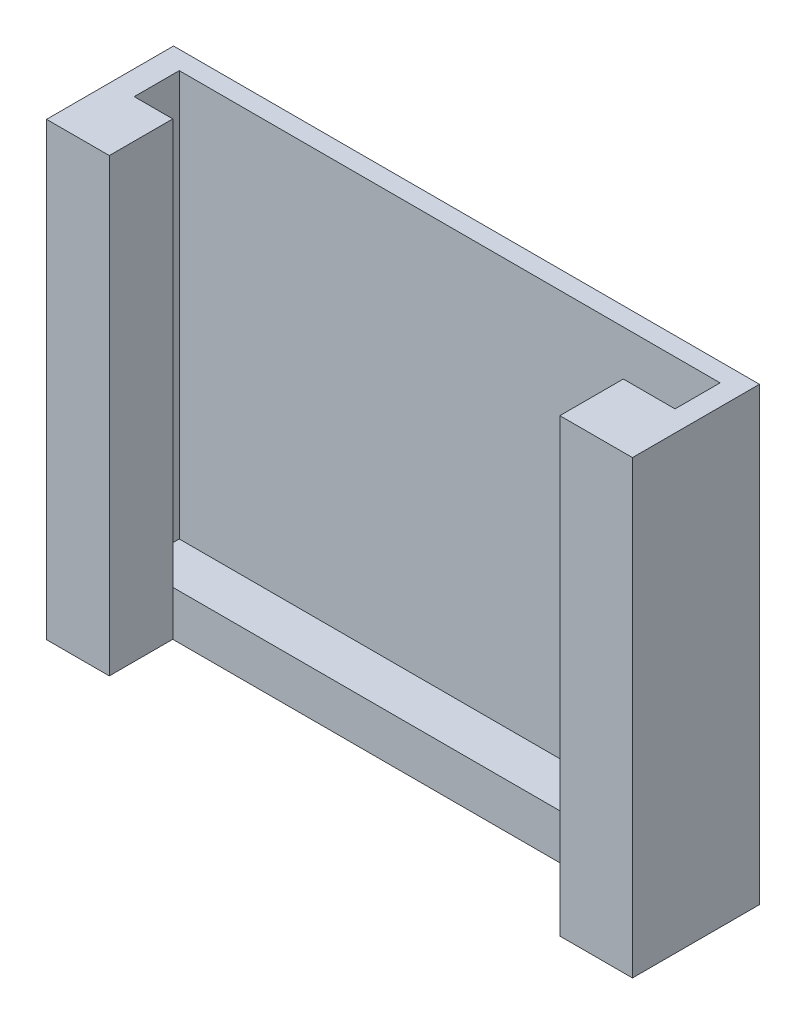
ISO-10303-21;
HEADER;
FILE_DESCRIPTION(('STEP AP214'),'2;1');
FILE_NAME('part.step','',(''),(''),'','','');
FILE_SCHEMA(('AUTOMOTIVE_DESIGN { 1 0 10303 214 1 1 1 1 }'));
ENDSEC;
DATA;
#1=APPLICATION_CONTEXT('core data for automotive mechanical design processes');
#2=APPLICATION_PROTOCOL_DEFINITION('international standard','automotive_design',2000,#1);
#3=PRODUCT_CONTEXT('',#1,'mechanical');
#4=PRODUCT('Part','Part','',(#3));
#5=PRODUCT_RELATED_PRODUCT_CATEGORY('part','',(#4));
#6=PRODUCT_DEFINITION_FORMATION('','',#4);
#7=PRODUCT_DEFINITION_CONTEXT('part definition',#1,'design');
#8=PRODUCT_DEFINITION('design','',#6,#7);
#9=PRODUCT_DEFINITION_SHAPE('','',#8);
#10=(LENGTH_UNIT() NAMED_UNIT(*) SI_UNIT(.MILLI.,.METRE.));
#11=(NAMED_UNIT(*) PLANE_ANGLE_UNIT() SI_UNIT($,.RADIAN.));
#12=(NAMED_UNIT(*) SI_UNIT($,.STERADIAN.) SOLID_ANGLE_UNIT());
#13=UNCERTAINTY_MEASURE_WITH_UNIT(LENGTH_MEASURE(1.E-05),#10,'distance_accuracy_value','');
#14=(GEOMETRIC_REPRESENTATION_CONTEXT(3) GLOBAL_UNCERTAINTY_ASSIGNED_CONTEXT((#13)) GLOBAL_UNIT_ASSIGNED_CONTEXT((#10,
#11,#12)) REPRESENTATION_CONTEXT('',''));
#15=CARTESIAN_POINT('',(0.,0.,0.));
#16=DIRECTION('',(0.,0.,1.));
#17=DIRECTION('',(1.,0.,0.));
#18=AXIS2_PLACEMENT_3D('',#15,#16,#17);
#19=CARTESIAN_POINT('',(6.03648479138952,0.999999999999999,-12.5905847925973));
#20=DIRECTION('',(0.,0.,1.));
#21=DIRECTION('',(1.,0.,0.));
#22=AXIS2_PLACEMENT_3D('',#19,#20,#21);
#23=PLANE('',#22);
#24=DIRECTION('',(1.,0.,0.));
#25=VECTOR('',#24,1.);
#26=CARTESIAN_POINT('',(6.03648479138952,0.999999999999999,-12.5905847925973));
#27=LINE('',#26,#25);
#28=CARTESIAN_POINT('',(4.88896204619608,0.999999999999999,-12.5905847925973));
#29=VERTEX_POINT('',#28);
#30=CARTESIAN_POINT('',(6.03648479138952,0.999999999999999,-12.5905847925973));
#31=VERTEX_POINT('',#30);
#32=EDGE_CURVE('E215',#29,#31,#27,.T.);
#33=ORIENTED_EDGE('',*,*,#32,.F.);
#34=DIRECTION('',(0.,1.,0.));
#35=VECTOR('',#34,1.);
#36=CARTESIAN_POINT('',(4.88896204619608,0.,-12.5905847925973));
#37=LINE('',#36,#35);
#38=CARTESIAN_POINT('',(4.88896204619608,10.,-12.5905847925973));
#39=VERTEX_POINT('',#38);
#40=EDGE_CURVE('E195',#29,#39,#37,.T.);
#41=ORIENTED_EDGE('',*,*,#40,.T.);
#42=DIRECTION('',(1.,0.,0.));
#43=VECTOR('',#42,1.);
#44=CARTESIAN_POINT('',(6.03648479138952,10.,-12.5905847925973));
#45=LINE('',#44,#43);
#46=CARTESIAN_POINT('',(6.03648479138952,10.,-12.5905847925973));
#47=VERTEX_POINT('',#46);
#48=EDGE_CURVE('E232',#39,#47,#45,.T.);
#49=ORIENTED_EDGE('',*,*,#48,.T.);
#50=DIRECTION('',(0.,1.,0.));
#51=VECTOR('',#50,1.);
#52=CARTESIAN_POINT('',(6.03648479138952,0.999999999999999,-12.5905847925973));
#53=LINE('',#52,#51);
#54=EDGE_CURVE('E243',#31,#47,#53,.T.);
#55=ORIENTED_EDGE('',*,*,#54,.F.);
#56=EDGE_LOOP('',(#33,#41,#49,#55));
#57=FACE_BOUND('',#56,.T.);
#58=ADVANCED_FACE('F45',(#57),#23,.F.);
#59=CARTESIAN_POINT('',(-6.5,10.,14.));
#60=DIRECTION('',(1.,0.,0.));
#61=DIRECTION('',(0.,0.,-1.));
#62=AXIS2_PLACEMENT_3D('',#59,#60,#61);
#63=PLANE('',#62);
#64=DIRECTION('',(0.,0.,1.));
#65=VECTOR('',#64,1.);
#66=CARTESIAN_POINT('',(-6.5,0.,14.));
#67=LINE('',#66,#65);
#68=CARTESIAN_POINT('',(-6.5,0.,-14.));
#69=VERTEX_POINT('',#68);
#70=CARTESIAN_POINT('',(-6.5,0.,-11.1825885608888));
#71=VERTEX_POINT('',#70);
#72=EDGE_CURVE('E242',#69,#71,#67,.T.);
#73=ORIENTED_EDGE('',*,*,#72,.T.);
#74=DIRECTION('',(0.,1.,0.));
#75=VECTOR('',#74,1.);
#76=CARTESIAN_POINT('',(-6.5,0.,-11.1825885608888));
#77=LINE('',#76,#75);
#78=CARTESIAN_POINT('',(-6.5,10.,-11.1825885608888));
#79=VERTEX_POINT('',#78);
#80=EDGE_CURVE('E202',#71,#79,#77,.T.);
#81=ORIENTED_EDGE('',*,*,#80,.T.);
#82=DIRECTION('',(0.,0.,1.));
#83=VECTOR('',#82,1.);
#84=CARTESIAN_POINT('',(-6.5,10.,14.));
#85=LINE('',#84,#83);
#86=CARTESIAN_POINT('',(-6.5,10.,-14.));
#87=VERTEX_POINT('',#86);
#88=EDGE_CURVE('E251',#87,#79,#85,.T.);
#89=ORIENTED_EDGE('',*,*,#88,.F.);
#90=DIRECTION('',(0.,-1.,0.));
#91=VECTOR('',#90,1.);
#92=CARTESIAN_POINT('',(-6.5,10.,-14.));
#93=LINE('',#92,#91);
#94=EDGE_CURVE('E54',#87,#69,#93,.T.);
#95=ORIENTED_EDGE('',*,*,#94,.T.);
#96=EDGE_LOOP('',(#73,#81,#89,#95));
#97=FACE_BOUND('',#96,.T.);
#98=ADVANCED_FACE('F47',(#97),#63,.F.);
#99=CARTESIAN_POINT('',(6.5,10.,14.));
#100=DIRECTION('',(-1.,0.,0.));
#101=DIRECTION('',(0.,0.,1.));
#102=AXIS2_PLACEMENT_3D('',#99,#100,#101);
#103=PLANE('',#102);
#104=DIRECTION('',(0.,0.,-1.));
#105=VECTOR('',#104,1.);
#106=CARTESIAN_POINT('',(6.5,10.,14.));
#107=LINE('',#106,#105);
#108=CARTESIAN_POINT('',(6.5,10.,-11.1825885608888));
#109=VERTEX_POINT('',#108);
#110=CARTESIAN_POINT('',(6.5,10.,-14.));
#111=VERTEX_POINT('',#110);
#112=EDGE_CURVE('E255',#109,#111,#107,.T.);
#113=ORIENTED_EDGE('',*,*,#112,.F.);
#114=DIRECTION('',(0.,1.,0.));
#115=VECTOR('',#114,1.);
#116=CARTESIAN_POINT('',(6.5,0.,-11.1825885608888));
#117=LINE('',#116,#115);
#118=CARTESIAN_POINT('',(6.5,0.,-11.1825885608888));
#119=VERTEX_POINT('',#118);
#120=EDGE_CURVE('E199',#119,#109,#117,.T.);
#121=ORIENTED_EDGE('',*,*,#120,.F.);
#122=DIRECTION('',(0.,0.,-1.));
#123=VECTOR('',#122,1.);
#124=CARTESIAN_POINT('',(6.5,0.,14.));
#125=LINE('',#124,#123);
#126=CARTESIAN_POINT('',(6.5,0.,-14.));
#127=VERTEX_POINT('',#126);
#128=EDGE_CURVE('E265',#119,#127,#125,.T.);
#129=ORIENTED_EDGE('',*,*,#128,.T.);
#130=DIRECTION('',(0.,-1.,0.));
#131=VECTOR('',#130,1.);
#132=CARTESIAN_POINT('',(6.5,10.,-14.));
#133=LINE('',#132,#131);
#134=EDGE_CURVE('E11',#111,#127,#133,.T.);
#135=ORIENTED_EDGE('',*,*,#134,.F.);
#136=EDGE_LOOP('',(#113,#121,#129,#135));
#137=FACE_BOUND('',#136,.T.);
#138=ADVANCED_FACE('F290',(#137),#103,.F.);
#139=CARTESIAN_POINT('',(6.5,10.,-14.));
#140=DIRECTION('',(0.,0.,1.));
#141=DIRECTION('',(1.,0.,0.));
#142=AXIS2_PLACEMENT_3D('',#139,#140,#141);
#143=PLANE('',#142);
#144=DIRECTION('',(-1.,0.,0.));
#145=VECTOR('',#144,1.);
#146=CARTESIAN_POINT('',(6.5,0.,-14.));
#147=LINE('',#146,#145);
#148=EDGE_CURVE('E256',#127,#69,#147,.T.);
#149=ORIENTED_EDGE('',*,*,#148,.T.);
#150=ORIENTED_EDGE('',*,*,#94,.F.);
#151=DIRECTION('',(-1.,0.,0.));
#152=VECTOR('',#151,1.);
#153=CARTESIAN_POINT('',(6.5,10.,-14.));
#154=LINE('',#153,#152);
#155=EDGE_CURVE('E259',#111,#87,#154,.T.);
#156=ORIENTED_EDGE('',*,*,#155,.F.);
#157=ORIENTED_EDGE('',*,*,#134,.T.);
#158=EDGE_LOOP('',(#149,#150,#156,#157));
#159=FACE_BOUND('',#158,.T.);
#160=ADVANCED_FACE('F288',(#159),#143,.F.);
#161=CARTESIAN_POINT('',(0.,10.,0.));
#162=DIRECTION('',(0.,1.,0.));
#163=DIRECTION('',(0.,0.,1.));
#164=AXIS2_PLACEMENT_3D('',#161,#162,#163);
#165=PLANE('',#164);
#166=DIRECTION('',(0.,0.,-1.));
#167=VECTOR('',#166,1.);
#168=CARTESIAN_POINT('',(4.88896204619608,10.,-11.1825885608888));
#169=LINE('',#168,#167);
#170=CARTESIAN_POINT('',(4.88896204619608,10.,-11.1825885608888));
#171=VERTEX_POINT('',#170);
#172=EDGE_CURVE('E170',#171,#39,#169,.T.);
#173=ORIENTED_EDGE('',*,*,#172,.F.);
#174=DIRECTION('',(-1.,0.,0.));
#175=VECTOR('',#174,1.);
#176=CARTESIAN_POINT('',(6.5,10.,-11.1825885608888));
#177=LINE('',#176,#175);
#178=EDGE_CURVE('E173',#109,#171,#177,.T.);
#179=ORIENTED_EDGE('',*,*,#178,.F.);
#180=ORIENTED_EDGE('',*,*,#112,.T.);
#181=ORIENTED_EDGE('',*,*,#155,.T.);
#182=ORIENTED_EDGE('',*,*,#88,.T.);
#183=DIRECTION('',(-1.,0.,0.));
#184=VECTOR('',#183,1.);
#185=CARTESIAN_POINT('',(-5.10787079453322,10.,-11.1825885608888));
#186=LINE('',#185,#184);
#187=CARTESIAN_POINT('',(-5.10787079453322,10.,-11.1825885608888));
#188=VERTEX_POINT('',#187);
#189=EDGE_CURVE('E186',#188,#79,#186,.T.);
#190=ORIENTED_EDGE('',*,*,#189,.F.);
#191=DIRECTION('',(0.,0.,1.));
#192=VECTOR('',#191,1.);
#193=CARTESIAN_POINT('',(-5.10787079453322,10.,-12.5905847925973));
#194=LINE('',#193,#192);
#195=CARTESIAN_POINT('',(-5.10787079453322,10.,-12.5905847925973));
#196=VERTEX_POINT('',#195);
#197=EDGE_CURVE('E183',#196,#188,#194,.T.);
#198=ORIENTED_EDGE('',*,*,#197,.F.);
#199=CARTESIAN_POINT('',(-5.96351520861048,10.,-12.5905847925973));
#200=VERTEX_POINT('',#199);
#201=EDGE_CURVE('E233',#200,#196,#45,.T.);
#202=ORIENTED_EDGE('',*,*,#201,.F.);
#203=DIRECTION('',(0.,0.,1.));
#204=VECTOR('',#203,1.);
#205=CARTESIAN_POINT('',(-5.96351520861048,10.,-12.5905847925973));
#206=LINE('',#205,#204);
#207=CARTESIAN_POINT('',(-5.96351520861048,10.,-13.5905847925973));
#208=VERTEX_POINT('',#207);
#209=EDGE_CURVE('E228',#208,#200,#206,.T.);
#210=ORIENTED_EDGE('',*,*,#209,.F.);
#211=DIRECTION('',(-1.,0.,0.));
#212=VECTOR('',#211,1.);
#213=CARTESIAN_POINT('',(0.,10.,-13.5905847925973));
#214=LINE('',#213,#212);
#215=CARTESIAN_POINT('',(6.03648479138952,10.,-13.5905847925973));
#216=VERTEX_POINT('',#215);
#217=EDGE_CURVE('E194',#216,#208,#214,.T.);
#218=ORIENTED_EDGE('',*,*,#217,.F.);
#219=DIRECTION('',(0.,0.,-1.));
#220=VECTOR('',#219,1.);
#221=CARTESIAN_POINT('',(6.03648479138952,10.,-13.5905847925973));
#222=LINE('',#221,#220);
#223=EDGE_CURVE('E69',#47,#216,#222,.T.);
#224=ORIENTED_EDGE('',*,*,#223,.F.);
#225=ORIENTED_EDGE('',*,*,#48,.F.);
#226=EDGE_LOOP('',(#173,#179,#180,#181,#182,#190,#198,#202,#210,#218,#224,#225));
#227=FACE_BOUND('',#226,.T.);
#228=ADVANCED_FACE('F283',(#227),#165,.T.);
#229=CARTESIAN_POINT('',(0.,0.,0.));
#230=DIRECTION('',(0.,1.,0.));
#231=DIRECTION('',(0.,0.,1.));
#232=AXIS2_PLACEMENT_3D('',#229,#230,#231);
#233=PLANE('',#232);
#234=ORIENTED_EDGE('',*,*,#128,.F.);
#235=DIRECTION('',(-1.,0.,0.));
#236=VECTOR('',#235,1.);
#237=CARTESIAN_POINT('',(6.5,0.,-11.1825885608888));
#238=LINE('',#237,#236);
#239=CARTESIAN_POINT('',(4.88896204619608,0.,-11.1825885608888));
#240=VERTEX_POINT('',#239);
#241=EDGE_CURVE('E178',#119,#240,#238,.T.);
#242=ORIENTED_EDGE('',*,*,#241,.T.);
#243=DIRECTION('',(0.,0.,-1.));
#244=VECTOR('',#243,1.);
#245=CARTESIAN_POINT('',(4.88896204619608,0.,-11.1825885608888));
#246=LINE('',#245,#244);
#247=CARTESIAN_POINT('',(4.88896204619608,0.,-12.5905847925973));
#248=VERTEX_POINT('',#247);
#249=EDGE_CURVE('E168',#240,#248,#246,.T.);
#250=ORIENTED_EDGE('',*,*,#249,.T.);
#251=DIRECTION('',(-1.,0.,0.));
#252=VECTOR('',#251,1.);
#253=CARTESIAN_POINT('',(4.88896204619608,0.,-12.5905847925973));
#254=LINE('',#253,#252);
#255=CARTESIAN_POINT('',(-5.10787079453322,0.,-12.5905847925973));
#256=VERTEX_POINT('',#255);
#257=EDGE_CURVE('E144',#248,#256,#254,.T.);
#258=ORIENTED_EDGE('',*,*,#257,.T.);
#259=DIRECTION('',(0.,0.,1.));
#260=VECTOR('',#259,1.);
#261=CARTESIAN_POINT('',(-5.10787079453322,0.,-12.5905847925973));
#262=LINE('',#261,#260);
#263=CARTESIAN_POINT('',(-5.10787079453322,0.,-11.1825885608888));
#264=VERTEX_POINT('',#263);
#265=EDGE_CURVE('E155',#256,#264,#262,.T.);
#266=ORIENTED_EDGE('',*,*,#265,.T.);
#267=DIRECTION('',(-1.,0.,0.));
#268=VECTOR('',#267,1.);
#269=CARTESIAN_POINT('',(-5.10787079453322,0.,-11.1825885608888));
#270=LINE('',#269,#268);
#271=EDGE_CURVE('E162',#264,#71,#270,.T.);
#272=ORIENTED_EDGE('',*,*,#271,.T.);
#273=ORIENTED_EDGE('',*,*,#72,.F.);
#274=ORIENTED_EDGE('',*,*,#148,.F.);
#275=EDGE_LOOP('',(#234,#242,#250,#258,#266,#272,#273,#274));
#276=FACE_BOUND('',#275,.T.);
#277=ADVANCED_FACE('F165',(#276),#233,.F.);
#278=CARTESIAN_POINT('',(6.03648479138952,0.999999999999999,-13.5905847925973));
#279=DIRECTION('',(1.,0.,0.));
#280=DIRECTION('',(0.,0.,-1.));
#281=AXIS2_PLACEMENT_3D('',#278,#279,#280);
#282=PLANE('',#281);
#283=ORIENTED_EDGE('',*,*,#223,.T.);
#284=DIRECTION('',(0.,1.,0.));
#285=VECTOR('',#284,1.);
#286=CARTESIAN_POINT('',(6.03648479138952,0.999999999999999,-13.5905847925973));
#287=LINE('',#286,#285);
#288=CARTESIAN_POINT('',(6.03648479138952,0.999999999999999,-13.5905847925973));
#289=VERTEX_POINT('',#288);
#290=EDGE_CURVE('E239',#289,#216,#287,.T.);
#291=ORIENTED_EDGE('',*,*,#290,.F.);
#292=DIRECTION('',(0.,0.,-1.));
#293=VECTOR('',#292,1.);
#294=CARTESIAN_POINT('',(6.03648479138952,0.999999999999999,-13.5905847925973));
#295=LINE('',#294,#293);
#296=EDGE_CURVE('E220',#31,#289,#295,.T.);
#297=ORIENTED_EDGE('',*,*,#296,.F.);
#298=ORIENTED_EDGE('',*,*,#54,.T.);
#299=EDGE_LOOP('',(#283,#291,#297,#298));
#300=FACE_BOUND('',#299,.T.);
#301=ADVANCED_FACE('F322',(#300),#282,.F.);
#302=ORIENTED_EDGE('',*,*,#201,.T.);
#303=DIRECTION('',(0.,1.,0.));
#304=VECTOR('',#303,1.);
#305=CARTESIAN_POINT('',(-5.10787079453322,0.,-12.5905847925973));
#306=LINE('',#305,#304);
#307=CARTESIAN_POINT('',(-5.10787079453322,0.999999999999999,-12.5905847925973));
#308=VERTEX_POINT('',#307);
#309=EDGE_CURVE('E152',#308,#196,#306,.T.);
#310=ORIENTED_EDGE('',*,*,#309,.F.);
#311=CARTESIAN_POINT('',(-5.96351520861048,0.999999999999999,-12.5905847925973));
#312=VERTEX_POINT('',#311);
#313=EDGE_CURVE('E216',#312,#308,#27,.T.);
#314=ORIENTED_EDGE('',*,*,#313,.F.);
#315=DIRECTION('',(0.,1.,0.));
#316=VECTOR('',#315,1.);
#317=CARTESIAN_POINT('',(-5.96351520861048,0.999999999999999,-12.5905847925973));
#318=LINE('',#317,#316);
#319=EDGE_CURVE('E246',#312,#200,#318,.T.);
#320=ORIENTED_EDGE('',*,*,#319,.T.);
#321=EDGE_LOOP('',(#302,#310,#314,#320));
#322=FACE_BOUND('',#321,.T.);
#323=ADVANCED_FACE('F313',(#322),#23,.F.);
#324=CARTESIAN_POINT('',(-5.96351520861048,0.999999999999999,-12.5905847925973));
#325=DIRECTION('',(-1.,0.,0.));
#326=DIRECTION('',(0.,0.,1.));
#327=AXIS2_PLACEMENT_3D('',#324,#325,#326);
#328=PLANE('',#327);
#329=ORIENTED_EDGE('',*,*,#209,.T.);
#330=ORIENTED_EDGE('',*,*,#319,.F.);
#331=DIRECTION('',(0.,0.,1.));
#332=VECTOR('',#331,1.);
#333=CARTESIAN_POINT('',(-5.96351520861048,0.999999999999999,-12.5905847925973));
#334=LINE('',#333,#332);
#335=CARTESIAN_POINT('',(-5.96351520861048,0.999999999999999,-13.5905847925973));
#336=VERTEX_POINT('',#335);
#337=EDGE_CURVE('E211',#336,#312,#334,.T.);
#338=ORIENTED_EDGE('',*,*,#337,.F.);
#339=DIRECTION('',(0.,1.,0.));
#340=VECTOR('',#339,1.);
#341=CARTESIAN_POINT('',(-5.96351520861048,0.999999999999999,-13.5905847925973));
#342=LINE('',#341,#340);
#343=EDGE_CURVE('E224',#336,#208,#342,.T.);
#344=ORIENTED_EDGE('',*,*,#343,.T.);
#345=EDGE_LOOP('',(#329,#330,#338,#344));
#346=FACE_BOUND('',#345,.T.);
#347=ADVANCED_FACE('F316',(#346),#328,.F.);
#348=CARTESIAN_POINT('',(0.,0.999999999999999,-13.5905847925973));
#349=DIRECTION('',(0.,0.,-1.));
#350=DIRECTION('',(-1.,0.,0.));
#351=AXIS2_PLACEMENT_3D('',#348,#349,#350);
#352=PLANE('',#351);
#353=ORIENTED_EDGE('',*,*,#217,.T.);
#354=ORIENTED_EDGE('',*,*,#343,.F.);
#355=DIRECTION('',(-1.,0.,0.));
#356=VECTOR('',#355,1.);
#357=CARTESIAN_POINT('',(0.,0.999999999999999,-13.5905847925973));
#358=LINE('',#357,#356);
#359=EDGE_CURVE('E208',#289,#336,#358,.T.);
#360=ORIENTED_EDGE('',*,*,#359,.F.);
#361=ORIENTED_EDGE('',*,*,#290,.T.);
#362=EDGE_LOOP('',(#353,#354,#360,#361));
#363=FACE_BOUND('',#362,.T.);
#364=ADVANCED_FACE('F320',(#363),#352,.F.);
#365=CARTESIAN_POINT('',(0.,0.999999999999999,0.));
#366=DIRECTION('',(0.,-1.,0.));
#367=DIRECTION('',(0.,0.,-1.));
#368=AXIS2_PLACEMENT_3D('',#365,#366,#367);
#369=PLANE('',#368);
#370=ORIENTED_EDGE('',*,*,#359,.T.);
#371=ORIENTED_EDGE('',*,*,#337,.T.);
#372=ORIENTED_EDGE('',*,*,#313,.T.);
#373=EDGE_CURVE('E147',#308,#29,#27,.T.);
#374=ORIENTED_EDGE('',*,*,#373,.T.);
#375=ORIENTED_EDGE('',*,*,#32,.T.);
#376=ORIENTED_EDGE('',*,*,#296,.T.);
#377=EDGE_LOOP('',(#370,#371,#372,#374,#375,#376));
#378=FACE_BOUND('',#377,.T.);
#379=ADVANCED_FACE('F305',(#378),#369,.F.);
#380=CARTESIAN_POINT('',(4.88896204619608,0.,-12.5905847925973));
#381=DIRECTION('',(0.,0.,-1.));
#382=DIRECTION('',(-1.,0.,0.));
#383=AXIS2_PLACEMENT_3D('',#380,#381,#382);
#384=PLANE('',#383);
#385=EDGE_CURVE('E140',#256,#308,#306,.T.);
#386=ORIENTED_EDGE('',*,*,#385,.F.);
#387=ORIENTED_EDGE('',*,*,#257,.F.);
#388=EDGE_CURVE('E61',#248,#29,#37,.T.);
#389=ORIENTED_EDGE('',*,*,#388,.T.);
#390=ORIENTED_EDGE('',*,*,#373,.F.);
#391=EDGE_LOOP('',(#386,#387,#389,#390));
#392=FACE_BOUND('',#391,.T.);
#393=ADVANCED_FACE('F142',(#392),#384,.F.);
#394=CARTESIAN_POINT('',(4.88896204619608,0.,-11.1825885608888));
#395=DIRECTION('',(1.,0.,0.));
#396=DIRECTION('',(0.,0.,-1.));
#397=AXIS2_PLACEMENT_3D('',#394,#395,#396);
#398=PLANE('',#397);
#399=ORIENTED_EDGE('',*,*,#172,.T.);
#400=ORIENTED_EDGE('',*,*,#40,.F.);
#401=ORIENTED_EDGE('',*,*,#388,.F.);
#402=ORIENTED_EDGE('',*,*,#249,.F.);
#403=DIRECTION('',(0.,1.,0.));
#404=VECTOR('',#403,1.);
#405=CARTESIAN_POINT('',(4.88896204619608,0.,-11.1825885608888));
#406=LINE('',#405,#404);
#407=EDGE_CURVE('E196',#240,#171,#406,.T.);
#408=ORIENTED_EDGE('',*,*,#407,.T.);
#409=EDGE_LOOP('',(#399,#400,#401,#402,#408));
#410=FACE_BOUND('',#409,.T.);
#411=ADVANCED_FACE('F295',(#410),#398,.F.);
#412=CARTESIAN_POINT('',(6.5,0.,-11.1825885608888));
#413=DIRECTION('',(0.,0.,-1.));
#414=DIRECTION('',(-1.,0.,0.));
#415=AXIS2_PLACEMENT_3D('',#412,#413,#414);
#416=PLANE('',#415);
#417=ORIENTED_EDGE('',*,*,#178,.T.);
#418=ORIENTED_EDGE('',*,*,#407,.F.);
#419=ORIENTED_EDGE('',*,*,#241,.F.);
#420=ORIENTED_EDGE('',*,*,#120,.T.);
#421=EDGE_LOOP('',(#417,#418,#419,#420));
#422=FACE_BOUND('',#421,.T.);
#423=ADVANCED_FACE('F293',(#422),#416,.F.);
#424=CARTESIAN_POINT('',(-5.10787079453322,0.,-11.1825885608888));
#425=DIRECTION('',(0.,0.,-1.));
#426=DIRECTION('',(-1.,0.,0.));
#427=AXIS2_PLACEMENT_3D('',#424,#425,#426);
#428=PLANE('',#427);
#429=ORIENTED_EDGE('',*,*,#189,.T.);
#430=ORIENTED_EDGE('',*,*,#80,.F.);
#431=ORIENTED_EDGE('',*,*,#271,.F.);
#432=DIRECTION('',(0.,1.,0.));
#433=VECTOR('',#432,1.);
#434=CARTESIAN_POINT('',(-5.10787079453322,0.,-11.1825885608888));
#435=LINE('',#434,#433);
#436=EDGE_CURVE('E151',#264,#188,#435,.T.);
#437=ORIENTED_EDGE('',*,*,#436,.T.);
#438=EDGE_LOOP('',(#429,#430,#431,#437));
#439=FACE_BOUND('',#438,.T.);
#440=ADVANCED_FACE('F279',(#439),#428,.F.);
#441=CARTESIAN_POINT('',(-5.10787079453322,0.,-12.5905847925973));
#442=DIRECTION('',(-1.,0.,0.));
#443=DIRECTION('',(0.,0.,1.));
#444=AXIS2_PLACEMENT_3D('',#441,#442,#443);
#445=PLANE('',#444);
#446=ORIENTED_EDGE('',*,*,#197,.T.);
#447=ORIENTED_EDGE('',*,*,#436,.F.);
#448=ORIENTED_EDGE('',*,*,#265,.F.);
#449=ORIENTED_EDGE('',*,*,#385,.T.);
#450=ORIENTED_EDGE('',*,*,#309,.T.);
#451=EDGE_LOOP('',(#446,#447,#448,#449,#450));
#452=FACE_BOUND('',#451,.T.);
#453=ADVANCED_FACE('F157',(#452),#445,.F.);
#454=CLOSED_SHELL('',(#58,#98,#138,#160,#228,#277,#301,#323,#347,#364,#379,#393,#411,#423,#440,#453));
#455=MANIFOLD_SOLID_BREP('B2',#454);
#456=ADVANCED_BREP_SHAPE_REPRESENTATION('',(#18,#455),#14);
#457=SHAPE_DEFINITION_REPRESENTATION(#9,#456);
ENDSEC;
END-ISO-10303-21;
